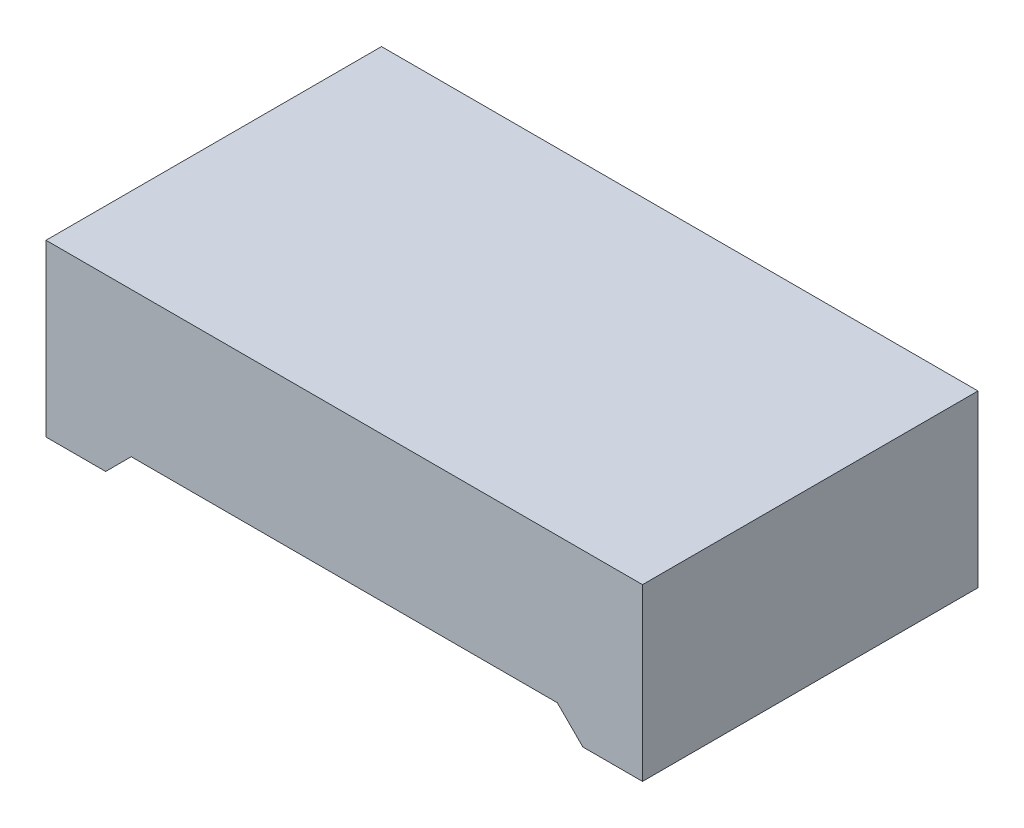
ISO-10303-21;
HEADER;
FILE_DESCRIPTION(('STEP AP214'),'2;1');
FILE_NAME('part.step','',(''),(''),'','','');
FILE_SCHEMA(('AUTOMOTIVE_DESIGN { 1 0 10303 214 1 1 1 1 }'));
ENDSEC;
DATA;
#1=APPLICATION_CONTEXT('core data for automotive mechanical design processes');
#2=APPLICATION_PROTOCOL_DEFINITION('international standard','automotive_design',2000,#1);
#3=PRODUCT_CONTEXT('',#1,'mechanical');
#4=PRODUCT('Part','Part','',(#3));
#5=PRODUCT_RELATED_PRODUCT_CATEGORY('part','',(#4));
#6=PRODUCT_DEFINITION_FORMATION('','',#4);
#7=PRODUCT_DEFINITION_CONTEXT('part definition',#1,'design');
#8=PRODUCT_DEFINITION('design','',#6,#7);
#9=PRODUCT_DEFINITION_SHAPE('','',#8);
#10=(LENGTH_UNIT() NAMED_UNIT(*) SI_UNIT(.MILLI.,.METRE.));
#11=(NAMED_UNIT(*) PLANE_ANGLE_UNIT() SI_UNIT($,.RADIAN.));
#12=(NAMED_UNIT(*) SI_UNIT($,.STERADIAN.) SOLID_ANGLE_UNIT());
#13=UNCERTAINTY_MEASURE_WITH_UNIT(LENGTH_MEASURE(1.E-05),#10,'distance_accuracy_value','');
#14=(GEOMETRIC_REPRESENTATION_CONTEXT(3) GLOBAL_UNCERTAINTY_ASSIGNED_CONTEXT((#13)) GLOBAL_UNIT_ASSIGNED_CONTEXT((#10,
#11,#12)) REPRESENTATION_CONTEXT('',''));
#15=CARTESIAN_POINT('',(0.,0.,0.));
#16=DIRECTION('',(0.,0.,1.));
#17=DIRECTION('',(1.,0.,0.));
#18=AXIS2_PLACEMENT_3D('',#15,#16,#17);
#19=CARTESIAN_POINT('',(3.556,-1.27,0.));
#20=DIRECTION('',(-0.707106781186548,-0.707106781186548,0.));
#21=DIRECTION('',(0.707106781186548,-0.707106781186548,0.));
#22=AXIS2_PLACEMENT_3D('',#19,#20,#21);
#23=PLANE('',#22);
#24=DIRECTION('',(0.,0.,-1.));
#25=VECTOR('',#24,1.);
#26=CARTESIAN_POINT('',(3.175,-0.889,0.));
#27=LINE('',#26,#25);
#28=CARTESIAN_POINT('',(3.175,-0.889,0.));
#29=VERTEX_POINT('',#28);
#30=CARTESIAN_POINT('',(3.175,-0.889,5.));
#31=VERTEX_POINT('',#30);
#32=EDGE_CURVE('E116',#29,#31,#27,.F.);
#33=ORIENTED_EDGE('',*,*,#32,.F.);
#34=DIRECTION('',(0.707106781186548,-0.707106781186548,0.));
#35=VECTOR('',#34,1.);
#36=CARTESIAN_POINT('',(3.556,-1.27,0.));
#37=LINE('',#36,#35);
#38=CARTESIAN_POINT('',(3.556,-1.27,0.));
#39=VERTEX_POINT('',#38);
#40=EDGE_CURVE('E95',#29,#39,#37,.T.);
#41=ORIENTED_EDGE('',*,*,#40,.T.);
#42=DIRECTION('',(0.,0.,-1.));
#43=VECTOR('',#42,1.);
#44=CARTESIAN_POINT('',(3.556,-1.27,0.));
#45=LINE('',#44,#43);
#46=CARTESIAN_POINT('',(3.556,-1.27,5.));
#47=VERTEX_POINT('',#46);
#48=EDGE_CURVE('E119',#47,#39,#45,.T.);
#49=ORIENTED_EDGE('',*,*,#48,.F.);
#50=DIRECTION('',(0.707106781186548,-0.707106781186548,0.));
#51=VECTOR('',#50,1.);
#52=CARTESIAN_POINT('',(3.556,-1.27,5.));
#53=LINE('',#52,#51);
#54=EDGE_CURVE('E20',#47,#31,#53,.F.);
#55=ORIENTED_EDGE('',*,*,#54,.T.);
#56=EDGE_LOOP('',(#33,#41,#49,#55));
#57=FACE_BOUND('',#56,.T.);
#58=ADVANCED_FACE('F17',(#57),#23,.T.);
#59=CARTESIAN_POINT('',(-3.175,-0.889,0.));
#60=DIRECTION('',(0.707106781186548,-0.707106781186548,0.));
#61=DIRECTION('',(0.707106781186548,0.707106781186548,0.));
#62=AXIS2_PLACEMENT_3D('',#59,#60,#61);
#63=PLANE('',#62);
#64=DIRECTION('',(0.,0.,-1.));
#65=VECTOR('',#64,1.);
#66=CARTESIAN_POINT('',(-3.556,-1.27,0.));
#67=LINE('',#66,#65);
#68=CARTESIAN_POINT('',(-3.556,-1.27,0.));
#69=VERTEX_POINT('',#68);
#70=CARTESIAN_POINT('',(-3.556,-1.27,5.));
#71=VERTEX_POINT('',#70);
#72=EDGE_CURVE('E88',#69,#71,#67,.F.);
#73=ORIENTED_EDGE('',*,*,#72,.F.);
#74=DIRECTION('',(0.707106781186548,0.707106781186548,0.));
#75=VECTOR('',#74,1.);
#76=CARTESIAN_POINT('',(-3.175,-0.889,0.));
#77=LINE('',#76,#75);
#78=CARTESIAN_POINT('',(-3.175,-0.889,0.));
#79=VERTEX_POINT('',#78);
#80=EDGE_CURVE('E79',#69,#79,#77,.T.);
#81=ORIENTED_EDGE('',*,*,#80,.T.);
#82=DIRECTION('',(0.,0.,-1.));
#83=VECTOR('',#82,1.);
#84=CARTESIAN_POINT('',(-3.175,-0.889,0.));
#85=LINE('',#84,#83);
#86=CARTESIAN_POINT('',(-3.175,-0.889,5.));
#87=VERTEX_POINT('',#86);
#88=EDGE_CURVE('E91',#87,#79,#85,.T.);
#89=ORIENTED_EDGE('',*,*,#88,.F.);
#90=DIRECTION('',(0.707106781186548,0.707106781186548,0.));
#91=VECTOR('',#90,1.);
#92=CARTESIAN_POINT('',(-3.175,-0.889,5.));
#93=LINE('',#92,#91);
#94=EDGE_CURVE('E84',#87,#71,#93,.F.);
#95=ORIENTED_EDGE('',*,*,#94,.T.);
#96=EDGE_LOOP('',(#73,#81,#89,#95));
#97=FACE_BOUND('',#96,.T.);
#98=ADVANCED_FACE('F86',(#97),#63,.T.);
#99=CARTESIAN_POINT('',(-3.556,-1.27,0.));
#100=DIRECTION('',(0.,-1.,0.));
#101=DIRECTION('',(0.,0.,-1.));
#102=AXIS2_PLACEMENT_3D('',#99,#100,#101);
#103=PLANE('',#102);
#104=DIRECTION('',(0.,0.,1.));
#105=VECTOR('',#104,1.);
#106=CARTESIAN_POINT('',(-4.445,-1.27,0.));
#107=LINE('',#106,#105);
#108=CARTESIAN_POINT('',(-4.445,-1.27,0.));
#109=VERTEX_POINT('',#108);
#110=CARTESIAN_POINT('',(-4.445,-1.27,5.));
#111=VERTEX_POINT('',#110);
#112=EDGE_CURVE('E131',#109,#111,#107,.T.);
#113=ORIENTED_EDGE('',*,*,#112,.F.);
#114=DIRECTION('',(1.,0.,0.));
#115=VECTOR('',#114,1.);
#116=CARTESIAN_POINT('',(-3.556,-1.27,0.));
#117=LINE('',#116,#115);
#118=EDGE_CURVE('E105',#109,#69,#117,.T.);
#119=ORIENTED_EDGE('',*,*,#118,.T.);
#120=ORIENTED_EDGE('',*,*,#72,.T.);
#121=DIRECTION('',(1.,0.,0.));
#122=VECTOR('',#121,1.);
#123=CARTESIAN_POINT('',(-3.556,-1.27,5.));
#124=LINE('',#123,#122);
#125=EDGE_CURVE('E98',#71,#111,#124,.F.);
#126=ORIENTED_EDGE('',*,*,#125,.T.);
#127=EDGE_LOOP('',(#113,#119,#120,#126));
#128=FACE_BOUND('',#127,.T.);
#129=ADVANCED_FACE('F107',(#128),#103,.T.);
#130=CARTESIAN_POINT('',(4.445,-1.27,0.));
#131=DIRECTION('',(0.,-1.,0.));
#132=DIRECTION('',(0.,0.,-1.));
#133=AXIS2_PLACEMENT_3D('',#130,#131,#132);
#134=PLANE('',#133);
#135=ORIENTED_EDGE('',*,*,#48,.T.);
#136=DIRECTION('',(1.,0.,0.));
#137=VECTOR('',#136,1.);
#138=CARTESIAN_POINT('',(4.445,-1.27,0.));
#139=LINE('',#138,#137);
#140=CARTESIAN_POINT('',(4.445,-1.27,0.));
#141=VERTEX_POINT('',#140);
#142=EDGE_CURVE('E125',#39,#141,#139,.T.);
#143=ORIENTED_EDGE('',*,*,#142,.T.);
#144=DIRECTION('',(0.,0.,-1.));
#145=VECTOR('',#144,1.);
#146=CARTESIAN_POINT('',(4.445,-1.27,0.));
#147=LINE('',#146,#145);
#148=CARTESIAN_POINT('',(4.445,-1.27,5.));
#149=VERTEX_POINT('',#148);
#150=EDGE_CURVE('E141',#149,#141,#147,.T.);
#151=ORIENTED_EDGE('',*,*,#150,.F.);
#152=DIRECTION('',(1.,0.,0.));
#153=VECTOR('',#152,1.);
#154=CARTESIAN_POINT('',(-4.445,-1.27,5.));
#155=LINE('',#154,#153);
#156=EDGE_CURVE('E127',#47,#149,#155,.T.);
#157=ORIENTED_EDGE('',*,*,#156,.F.);
#158=EDGE_LOOP('',(#135,#143,#151,#157));
#159=FACE_BOUND('',#158,.T.);
#160=ADVANCED_FACE('F139',(#159),#134,.T.);
#161=CARTESIAN_POINT('',(3.175,-0.889,0.));
#162=DIRECTION('',(0.,-1.,0.));
#163=DIRECTION('',(0.,0.,-1.));
#164=AXIS2_PLACEMENT_3D('',#161,#162,#163);
#165=PLANE('',#164);
#166=ORIENTED_EDGE('',*,*,#88,.T.);
#167=DIRECTION('',(1.,0.,0.));
#168=VECTOR('',#167,1.);
#169=CARTESIAN_POINT('',(-4.445,-0.889,0.));
#170=LINE('',#169,#168);
#171=EDGE_CURVE('E124',#79,#29,#170,.T.);
#172=ORIENTED_EDGE('',*,*,#171,.T.);
#173=ORIENTED_EDGE('',*,*,#32,.T.);
#174=DIRECTION('',(1.,0.,0.));
#175=VECTOR('',#174,1.);
#176=CARTESIAN_POINT('',(-4.445,-0.889,5.));
#177=LINE('',#176,#175);
#178=EDGE_CURVE('E123',#87,#31,#177,.T.);
#179=ORIENTED_EDGE('',*,*,#178,.F.);
#180=EDGE_LOOP('',(#166,#172,#173,#179));
#181=FACE_BOUND('',#180,.T.);
#182=ADVANCED_FACE('F122',(#181),#165,.T.);
#183=CARTESIAN_POINT('',(-4.445,-1.27,0.));
#184=DIRECTION('',(-1.,0.,0.));
#185=DIRECTION('',(0.,0.,1.));
#186=AXIS2_PLACEMENT_3D('',#183,#184,#185);
#187=PLANE('',#186);
#188=DIRECTION('',(0.,0.,1.));
#189=VECTOR('',#188,1.);
#190=CARTESIAN_POINT('',(-4.445,1.27,0.));
#191=LINE('',#190,#189);
#192=CARTESIAN_POINT('',(-4.445,1.27,0.));
#193=VERTEX_POINT('',#192);
#194=CARTESIAN_POINT('',(-4.445,1.27,5.));
#195=VERTEX_POINT('',#194);
#196=EDGE_CURVE('E151',#193,#195,#191,.T.);
#197=ORIENTED_EDGE('',*,*,#196,.F.);
#198=DIRECTION('',(0.,1.,0.));
#199=VECTOR('',#198,1.);
#200=CARTESIAN_POINT('',(-4.445,1.27,0.));
#201=LINE('',#200,#199);
#202=EDGE_CURVE('E157',#193,#109,#201,.F.);
#203=ORIENTED_EDGE('',*,*,#202,.T.);
#204=ORIENTED_EDGE('',*,*,#112,.T.);
#205=DIRECTION('',(0.,1.,0.));
#206=VECTOR('',#205,1.);
#207=CARTESIAN_POINT('',(-4.445,1.27,5.));
#208=LINE('',#207,#206);
#209=EDGE_CURVE('E101',#195,#111,#208,.F.);
#210=ORIENTED_EDGE('',*,*,#209,.F.);
#211=EDGE_LOOP('',(#197,#203,#204,#210));
#212=FACE_BOUND('',#211,.T.);
#213=ADVANCED_FACE('F163',(#212),#187,.T.);
#214=CARTESIAN_POINT('',(-4.445,1.27,5.));
#215=DIRECTION('',(0.,0.,1.));
#216=DIRECTION('',(1.,0.,0.));
#217=AXIS2_PLACEMENT_3D('',#214,#215,#216);
#218=PLANE('',#217);
#219=DIRECTION('',(0.,1.,0.));
#220=VECTOR('',#219,1.);
#221=CARTESIAN_POINT('',(4.445,1.27,5.));
#222=LINE('',#221,#220);
#223=CARTESIAN_POINT('',(4.445,1.27,5.));
#224=VERTEX_POINT('',#223);
#225=EDGE_CURVE('E129',#224,#149,#222,.F.);
#226=ORIENTED_EDGE('',*,*,#225,.F.);
#227=DIRECTION('',(1.,0.,0.));
#228=VECTOR('',#227,1.);
#229=CARTESIAN_POINT('',(-4.445,1.27,5.));
#230=LINE('',#229,#228);
#231=EDGE_CURVE('E144',#195,#224,#230,.T.);
#232=ORIENTED_EDGE('',*,*,#231,.F.);
#233=ORIENTED_EDGE('',*,*,#209,.T.);
#234=ORIENTED_EDGE('',*,*,#125,.F.);
#235=ORIENTED_EDGE('',*,*,#94,.F.);
#236=ORIENTED_EDGE('',*,*,#178,.T.);
#237=ORIENTED_EDGE('',*,*,#54,.F.);
#238=ORIENTED_EDGE('',*,*,#156,.T.);
#239=EDGE_LOOP('',(#226,#232,#233,#234,#235,#236,#237,#238));
#240=FACE_BOUND('',#239,.T.);
#241=ADVANCED_FACE('F99',(#240),#218,.T.);
#242=CARTESIAN_POINT('',(4.445,1.27,0.));
#243=DIRECTION('',(1.,0.,0.));
#244=DIRECTION('',(0.,0.,-1.));
#245=AXIS2_PLACEMENT_3D('',#242,#243,#244);
#246=PLANE('',#245);
#247=ORIENTED_EDGE('',*,*,#150,.T.);
#248=DIRECTION('',(0.,1.,0.));
#249=VECTOR('',#248,1.);
#250=CARTESIAN_POINT('',(4.445,1.27,0.));
#251=LINE('',#250,#249);
#252=CARTESIAN_POINT('',(4.445,1.27,0.));
#253=VERTEX_POINT('',#252);
#254=EDGE_CURVE('E35',#141,#253,#251,.T.);
#255=ORIENTED_EDGE('',*,*,#254,.T.);
#256=DIRECTION('',(0.,0.,1.));
#257=VECTOR('',#256,1.);
#258=CARTESIAN_POINT('',(4.445,1.27,0.));
#259=LINE('',#258,#257);
#260=EDGE_CURVE('E26',#224,#253,#259,.F.);
#261=ORIENTED_EDGE('',*,*,#260,.F.);
#262=ORIENTED_EDGE('',*,*,#225,.T.);
#263=EDGE_LOOP('',(#247,#255,#261,#262));
#264=FACE_BOUND('',#263,.T.);
#265=ADVANCED_FACE('F147',(#264),#246,.T.);
#266=CARTESIAN_POINT('',(-4.445,1.27,0.));
#267=DIRECTION('',(0.,0.,1.));
#268=DIRECTION('',(1.,0.,0.));
#269=AXIS2_PLACEMENT_3D('',#266,#267,#268);
#270=PLANE('',#269);
#271=ORIENTED_EDGE('',*,*,#254,.F.);
#272=ORIENTED_EDGE('',*,*,#142,.F.);
#273=ORIENTED_EDGE('',*,*,#40,.F.);
#274=ORIENTED_EDGE('',*,*,#171,.F.);
#275=ORIENTED_EDGE('',*,*,#80,.F.);
#276=ORIENTED_EDGE('',*,*,#118,.F.);
#277=ORIENTED_EDGE('',*,*,#202,.F.);
#278=DIRECTION('',(1.,0.,0.));
#279=VECTOR('',#278,1.);
#280=CARTESIAN_POINT('',(-4.445,1.27,0.));
#281=LINE('',#280,#279);
#282=EDGE_CURVE('E11',#253,#193,#281,.F.);
#283=ORIENTED_EDGE('',*,*,#282,.F.);
#284=EDGE_LOOP('',(#271,#272,#273,#274,#275,#276,#277,#283));
#285=FACE_BOUND('',#284,.T.);
#286=ADVANCED_FACE('F160',(#285),#270,.F.);
#287=CARTESIAN_POINT('',(-4.445,1.27,0.));
#288=DIRECTION('',(0.,1.,0.));
#289=DIRECTION('',(0.,0.,1.));
#290=AXIS2_PLACEMENT_3D('',#287,#288,#289);
#291=PLANE('',#290);
#292=ORIENTED_EDGE('',*,*,#260,.T.);
#293=ORIENTED_EDGE('',*,*,#282,.T.);
#294=ORIENTED_EDGE('',*,*,#196,.T.);
#295=ORIENTED_EDGE('',*,*,#231,.T.);
#296=EDGE_LOOP('',(#292,#293,#294,#295));
#297=FACE_BOUND('',#296,.T.);
#298=ADVANCED_FACE('F150',(#297),#291,.T.);
#299=CLOSED_SHELL('',(#58,#98,#129,#160,#182,#213,#241,#265,#286,#298));
#300=MANIFOLD_SOLID_BREP('B1',#299);
#301=ADVANCED_BREP_SHAPE_REPRESENTATION('',(#18,#300),#14);
#302=SHAPE_DEFINITION_REPRESENTATION(#9,#301);
ENDSEC;
END-ISO-10303-21;
